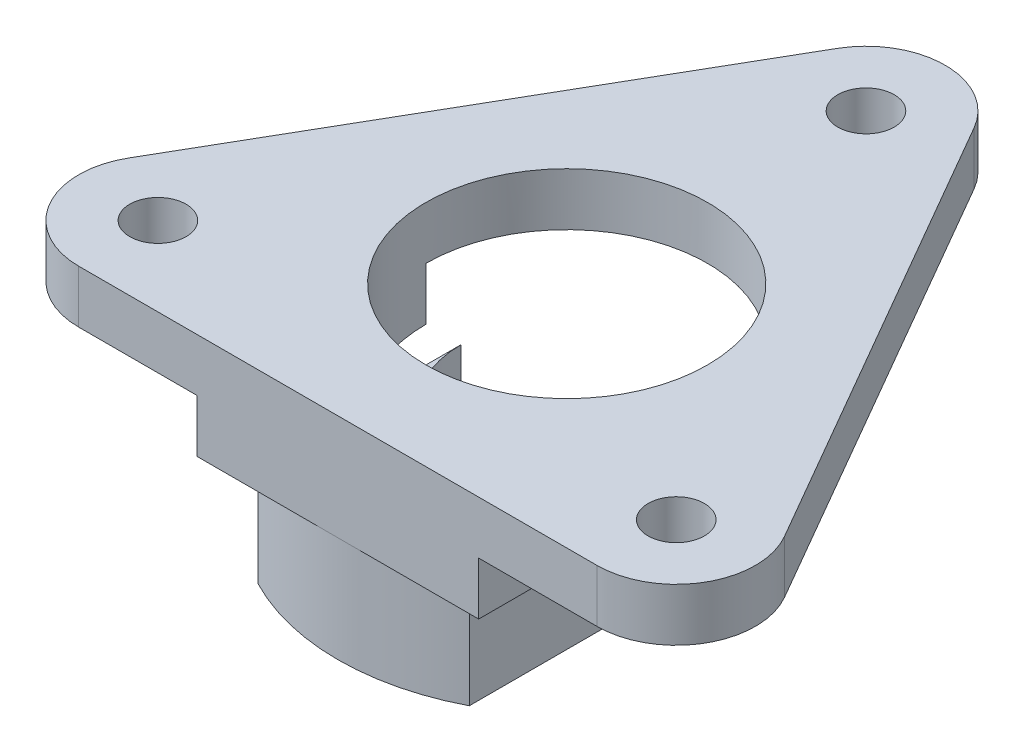
ISO-10303-21;
HEADER;
FILE_DESCRIPTION(('STEP AP214'),'2;1');
FILE_NAME('part.step','',(''),(''),'','','');
FILE_SCHEMA(('AUTOMOTIVE_DESIGN { 1 0 10303 214 1 1 1 1 }'));
ENDSEC;
DATA;
#1=APPLICATION_CONTEXT('core data for automotive mechanical design processes');
#2=APPLICATION_PROTOCOL_DEFINITION('international standard','automotive_design',2000,#1);
#3=PRODUCT_CONTEXT('',#1,'mechanical');
#4=PRODUCT('Part','Part','',(#3));
#5=PRODUCT_RELATED_PRODUCT_CATEGORY('part','',(#4));
#6=PRODUCT_DEFINITION_FORMATION('','',#4);
#7=PRODUCT_DEFINITION_CONTEXT('part definition',#1,'design');
#8=PRODUCT_DEFINITION('design','',#6,#7);
#9=PRODUCT_DEFINITION_SHAPE('','',#8);
#10=(LENGTH_UNIT() NAMED_UNIT(*) SI_UNIT(.MILLI.,.METRE.));
#11=(NAMED_UNIT(*) PLANE_ANGLE_UNIT() SI_UNIT($,.RADIAN.));
#12=(NAMED_UNIT(*) SI_UNIT($,.STERADIAN.) SOLID_ANGLE_UNIT());
#13=UNCERTAINTY_MEASURE_WITH_UNIT(LENGTH_MEASURE(1.E-05),#10,'distance_accuracy_value','');
#14=(GEOMETRIC_REPRESENTATION_CONTEXT(3) GLOBAL_UNCERTAINTY_ASSIGNED_CONTEXT((#13)) GLOBAL_UNIT_ASSIGNED_CONTEXT((#10,
#11,#12)) REPRESENTATION_CONTEXT('',''));
#15=CARTESIAN_POINT('',(0.,0.,0.));
#16=DIRECTION('',(0.,0.,1.));
#17=DIRECTION('',(1.,0.,0.));
#18=AXIS2_PLACEMENT_3D('',#15,#16,#17);
#19=CARTESIAN_POINT('',(0.,-19.160108376351,0.));
#20=DIRECTION('',(0.,1.,0.));
#21=DIRECTION('',(0.,0.,1.));
#22=AXIS2_PLACEMENT_3D('',#19,#20,#21);
#23=CYLINDRICAL_SURFACE('',#22,6.);
#24=CARTESIAN_POINT('',(0.,-13.160108376351,0.));
#25=DIRECTION('',(0.,-1.,0.));
#26=DIRECTION('',(0.,0.,1.));
#27=AXIS2_PLACEMENT_3D('',#24,#25,#26);
#28=CIRCLE('',#27,6.);
#29=CARTESIAN_POINT('',(6.,-13.160108376351,0.));
#30=VERTEX_POINT('',#29);
#31=CARTESIAN_POINT('',(-6.,-13.160108376351,0.));
#32=VERTEX_POINT('',#31);
#33=EDGE_CURVE('E205',#30,#32,#28,.T.);
#34=ORIENTED_EDGE('',*,*,#33,.F.);
#35=DIRECTION('',(0.,1.,0.));
#36=VECTOR('',#35,1.);
#37=CARTESIAN_POINT('',(6.,-19.160108376351,0.));
#38=LINE('',#37,#36);
#39=CARTESIAN_POINT('',(6.,-19.160108376351,0.));
#40=VERTEX_POINT('',#39);
#41=EDGE_CURVE('E43',#40,#30,#38,.T.);
#42=ORIENTED_EDGE('',*,*,#41,.F.);
#43=CARTESIAN_POINT('',(0.,-19.160108376351,0.));
#44=DIRECTION('',(0.,-1.,0.));
#45=DIRECTION('',(0.,0.,1.));
#46=AXIS2_PLACEMENT_3D('',#43,#44,#45);
#47=CIRCLE('',#46,6.);
#48=CARTESIAN_POINT('',(-6.,-19.160108376351,0.));
#49=VERTEX_POINT('',#48);
#50=EDGE_CURVE('E206',#40,#49,#47,.T.);
#51=ORIENTED_EDGE('',*,*,#50,.T.);
#52=DIRECTION('',(0.,1.,0.));
#53=VECTOR('',#52,1.);
#54=CARTESIAN_POINT('',(-6.,-19.160108376351,0.));
#55=LINE('',#54,#53);
#56=EDGE_CURVE('E38',#49,#32,#55,.T.);
#57=ORIENTED_EDGE('',*,*,#56,.T.);
#58=EDGE_LOOP('',(#34,#42,#51,#57));
#59=FACE_BOUND('',#58,.T.);
#60=ADVANCED_FACE('F35',(#59),#23,.F.);
#61=CARTESIAN_POINT('',(6.,-19.160108376351,0.));
#62=DIRECTION('',(1.,0.,0.));
#63=DIRECTION('',(0.,0.,-1.));
#64=AXIS2_PLACEMENT_3D('',#61,#62,#63);
#65=PLANE('',#64);
#66=DIRECTION('',(0.,0.,-1.));
#67=VECTOR('',#66,1.);
#68=CARTESIAN_POINT('',(6.,-13.160108376351,0.));
#69=LINE('',#68,#67);
#70=CARTESIAN_POINT('',(6.,-13.160108376351,11.5325625946708));
#71=VERTEX_POINT('',#70);
#72=CARTESIAN_POINT('',(6.,-13.160108376351,5.29150262212918));
#73=VERTEX_POINT('',#72);
#74=EDGE_CURVE('E210',#71,#73,#69,.T.);
#75=ORIENTED_EDGE('',*,*,#74,.F.);
#76=DIRECTION('',(0.,1.,0.));
#77=VECTOR('',#76,1.);
#78=CARTESIAN_POINT('',(6.,-19.160108376351,11.5325625946708));
#79=LINE('',#78,#77);
#80=CARTESIAN_POINT('',(6.,-19.160108376351,11.5325625946708));
#81=VERTEX_POINT('',#80);
#82=EDGE_CURVE('E231',#81,#71,#79,.T.);
#83=ORIENTED_EDGE('',*,*,#82,.F.);
#84=DIRECTION('',(0.,0.,-1.));
#85=VECTOR('',#84,1.);
#86=CARTESIAN_POINT('',(6.,-19.160108376351,0.));
#87=LINE('',#86,#85);
#88=EDGE_CURVE('E216',#81,#40,#87,.T.);
#89=ORIENTED_EDGE('',*,*,#88,.T.);
#90=ORIENTED_EDGE('',*,*,#41,.T.);
#91=EDGE_CURVE('E226',#73,#30,#69,.T.);
#92=ORIENTED_EDGE('',*,*,#91,.F.);
#93=EDGE_LOOP('',(#75,#83,#89,#90,#92));
#94=FACE_BOUND('',#93,.T.);
#95=ADVANCED_FACE('F246',(#94),#65,.T.);
#96=CARTESIAN_POINT('',(0.,-19.160108376351,0.));
#97=DIRECTION('',(0.,1.,0.));
#98=DIRECTION('',(0.,0.,1.));
#99=AXIS2_PLACEMENT_3D('',#96,#97,#98);
#100=CYLINDRICAL_SURFACE('',#99,13.);
#101=CARTESIAN_POINT('',(0.,-13.160108376351,0.));
#102=DIRECTION('',(0.,1.,0.));
#103=DIRECTION('',(0.,0.,1.));
#104=AXIS2_PLACEMENT_3D('',#101,#102,#103);
#105=CIRCLE('',#104,13.);
#106=CARTESIAN_POINT('',(-6.,-13.160108376351,11.5325625946708));
#107=VERTEX_POINT('',#106);
#108=CARTESIAN_POINT('',(0.,-13.160108376351,13.));
#109=VERTEX_POINT('',#108);
#110=EDGE_CURVE('E224',#107,#109,#105,.T.);
#111=ORIENTED_EDGE('',*,*,#110,.F.);
#112=DIRECTION('',(0.,1.,0.));
#113=VECTOR('',#112,1.);
#114=CARTESIAN_POINT('',(-6.,-19.160108376351,11.5325625946708));
#115=LINE('',#114,#113);
#116=CARTESIAN_POINT('',(-6.,-19.160108376351,11.5325625946708));
#117=VERTEX_POINT('',#116);
#118=EDGE_CURVE('E232',#117,#107,#115,.T.);
#119=ORIENTED_EDGE('',*,*,#118,.F.);
#120=CARTESIAN_POINT('',(0.,-19.160108376351,0.));
#121=DIRECTION('',(0.,1.,0.));
#122=DIRECTION('',(0.,0.,1.));
#123=AXIS2_PLACEMENT_3D('',#120,#121,#122);
#124=CIRCLE('',#123,13.);
#125=EDGE_CURVE('E213',#117,#81,#124,.T.);
#126=ORIENTED_EDGE('',*,*,#125,.T.);
#127=ORIENTED_EDGE('',*,*,#82,.T.);
#128=EDGE_CURVE('E59',#109,#71,#105,.T.);
#129=ORIENTED_EDGE('',*,*,#128,.F.);
#130=EDGE_LOOP('',(#111,#119,#126,#127,#129));
#131=FACE_BOUND('',#130,.T.);
#132=ADVANCED_FACE('F251',(#131),#100,.T.);
#133=CARTESIAN_POINT('',(-6.,-19.160108376351,0.));
#134=DIRECTION('',(-1.,0.,0.));
#135=DIRECTION('',(0.,0.,1.));
#136=AXIS2_PLACEMENT_3D('',#133,#134,#135);
#137=PLANE('',#136);
#138=DIRECTION('',(0.,0.,1.));
#139=VECTOR('',#138,1.);
#140=CARTESIAN_POINT('',(-6.,-13.160108376351,0.));
#141=LINE('',#140,#139);
#142=CARTESIAN_POINT('',(-6.,-13.160108376351,5.29150262212918));
#143=VERTEX_POINT('',#142);
#144=EDGE_CURVE('E222',#32,#143,#141,.T.);
#145=ORIENTED_EDGE('',*,*,#144,.F.);
#146=ORIENTED_EDGE('',*,*,#56,.F.);
#147=DIRECTION('',(0.,0.,1.));
#148=VECTOR('',#147,1.);
#149=CARTESIAN_POINT('',(-6.,-19.160108376351,0.));
#150=LINE('',#149,#148);
#151=EDGE_CURVE('E209',#49,#117,#150,.T.);
#152=ORIENTED_EDGE('',*,*,#151,.T.);
#153=ORIENTED_EDGE('',*,*,#118,.T.);
#154=EDGE_CURVE('E221',#143,#107,#141,.T.);
#155=ORIENTED_EDGE('',*,*,#154,.F.);
#156=EDGE_LOOP('',(#145,#146,#152,#153,#155));
#157=FACE_BOUND('',#156,.T.);
#158=ADVANCED_FACE('F240',(#157),#137,.T.);
#159=CARTESIAN_POINT('',(0.,-19.160108376351,0.));
#160=DIRECTION('',(0.,1.,0.));
#161=DIRECTION('',(0.,0.,1.));
#162=AXIS2_PLACEMENT_3D('',#159,#160,#161);
#163=PLANE('',#162);
#164=ORIENTED_EDGE('',*,*,#50,.F.);
#165=ORIENTED_EDGE('',*,*,#88,.F.);
#166=ORIENTED_EDGE('',*,*,#125,.F.);
#167=ORIENTED_EDGE('',*,*,#151,.F.);
#168=EDGE_LOOP('',(#164,#165,#166,#167));
#169=FACE_BOUND('',#168,.T.);
#170=ADVANCED_FACE('F249',(#169),#163,.F.);
#171=CARTESIAN_POINT('',(0.,-13.160108376351,0.));
#172=DIRECTION('',(0.,1.,0.));
#173=DIRECTION('',(0.,0.,1.));
#174=AXIS2_PLACEMENT_3D('',#171,#172,#173);
#175=PLANE('',#174);
#176=CARTESIAN_POINT('',(0.,-13.160108376351,0.));
#177=DIRECTION('',(0.,-1.,0.));
#178=DIRECTION('',(0.,0.,1.));
#179=AXIS2_PLACEMENT_3D('',#176,#177,#178);
#180=CIRCLE('',#179,8.);
#181=EDGE_CURVE('E11',#73,#143,#180,.T.);
#182=ORIENTED_EDGE('',*,*,#181,.F.);
#183=ORIENTED_EDGE('',*,*,#91,.T.);
#184=ORIENTED_EDGE('',*,*,#33,.T.);
#185=ORIENTED_EDGE('',*,*,#144,.T.);
#186=EDGE_LOOP('',(#182,#183,#184,#185));
#187=FACE_BOUND('',#186,.T.);
#188=ADVANCED_FACE('F243',(#187),#175,.T.);
#189=CARTESIAN_POINT('',(0.,-13.160108376351,0.));
#190=DIRECTION('',(0.,1.,0.));
#191=DIRECTION('',(0.,0.,1.));
#192=AXIS2_PLACEMENT_3D('',#189,#190,#191);
#193=PLANE('',#192);
#194=CARTESIAN_POINT('',(-8.,-13.160108376351,0.));
#195=VERTEX_POINT('',#194);
#196=EDGE_CURVE('E46',#143,#195,#180,.T.);
#197=ORIENTED_EDGE('',*,*,#196,.F.);
#198=ORIENTED_EDGE('',*,*,#154,.T.);
#199=ORIENTED_EDGE('',*,*,#110,.T.);
#200=DIRECTION('',(1.,0.,0.));
#201=VECTOR('',#200,1.);
#202=CARTESIAN_POINT('',(-8.,-13.160108376351,13.));
#203=LINE('',#202,#201);
#204=CARTESIAN_POINT('',(-8.,-13.160108376351,13.));
#205=VERTEX_POINT('',#204);
#206=EDGE_CURVE('E190',#205,#109,#203,.T.);
#207=ORIENTED_EDGE('',*,*,#206,.F.);
#208=DIRECTION('',(0.,0.,1.));
#209=VECTOR('',#208,1.);
#210=CARTESIAN_POINT('',(-8.,-13.160108376351,0.));
#211=LINE('',#210,#209);
#212=EDGE_CURVE('E187',#195,#205,#211,.T.);
#213=ORIENTED_EDGE('',*,*,#212,.F.);
#214=EDGE_LOOP('',(#197,#198,#199,#207,#213));
#215=FACE_BOUND('',#214,.T.);
#216=ADVANCED_FACE('F255',(#215),#193,.F.);
#217=CARTESIAN_POINT('',(8.,-13.160108376351,13.));
#218=VERTEX_POINT('',#217);
#219=EDGE_CURVE('E189',#109,#218,#203,.T.);
#220=ORIENTED_EDGE('',*,*,#219,.F.);
#221=ORIENTED_EDGE('',*,*,#128,.T.);
#222=ORIENTED_EDGE('',*,*,#74,.T.);
#223=CARTESIAN_POINT('',(8.,-13.160108376351,0.));
#224=VERTEX_POINT('',#223);
#225=EDGE_CURVE('E45',#224,#73,#180,.T.);
#226=ORIENTED_EDGE('',*,*,#225,.F.);
#227=DIRECTION('',(0.,0.,-1.));
#228=VECTOR('',#227,1.);
#229=CARTESIAN_POINT('',(8.,-13.160108376351,13.));
#230=LINE('',#229,#228);
#231=EDGE_CURVE('E182',#218,#224,#230,.T.);
#232=ORIENTED_EDGE('',*,*,#231,.F.);
#233=EDGE_LOOP('',(#220,#221,#222,#226,#232));
#234=FACE_BOUND('',#233,.T.);
#235=ADVANCED_FACE('F265',(#234),#193,.F.);
#236=CARTESIAN_POINT('',(0.,-10.160108376351,0.));
#237=DIRECTION('',(0.,-1.,0.));
#238=DIRECTION('',(0.,0.,-1.));
#239=AXIS2_PLACEMENT_3D('',#236,#237,#238);
#240=CYLINDRICAL_SURFACE('',#239,8.);
#241=ORIENTED_EDGE('',*,*,#225,.T.);
#242=ORIENTED_EDGE('',*,*,#181,.T.);
#243=ORIENTED_EDGE('',*,*,#196,.T.);
#244=DIRECTION('',(0.,-1.,0.));
#245=VECTOR('',#244,1.);
#246=CARTESIAN_POINT('',(-8.,-10.160108376351,0.));
#247=LINE('',#246,#245);
#248=CARTESIAN_POINT('',(-8.,-10.160108376351,0.));
#249=VERTEX_POINT('',#248);
#250=EDGE_CURVE('E202',#249,#195,#247,.T.);
#251=ORIENTED_EDGE('',*,*,#250,.F.);
#252=CARTESIAN_POINT('',(0.,-10.160108376351,0.));
#253=DIRECTION('',(0.,1.,0.));
#254=DIRECTION('',(0.,0.,1.));
#255=AXIS2_PLACEMENT_3D('',#252,#253,#254);
#256=CIRCLE('',#255,8.);
#257=CARTESIAN_POINT('',(8.,-10.160108376351,0.));
#258=VERTEX_POINT('',#257);
#259=EDGE_CURVE('E278',#258,#249,#256,.T.);
#260=ORIENTED_EDGE('',*,*,#259,.F.);
#261=DIRECTION('',(0.,-1.,0.));
#262=VECTOR('',#261,1.);
#263=CARTESIAN_POINT('',(8.,-10.160108376351,0.));
#264=LINE('',#263,#262);
#265=EDGE_CURVE('E184',#258,#224,#264,.T.);
#266=ORIENTED_EDGE('',*,*,#265,.T.);
#267=EDGE_LOOP('',(#241,#242,#243,#251,#260,#266));
#268=FACE_BOUND('',#267,.T.);
#269=CARTESIAN_POINT('',(0.,-7.16010837635103,0.));
#270=DIRECTION('',(0.,1.,0.));
#271=DIRECTION('',(0.,0.,1.));
#272=AXIS2_PLACEMENT_3D('',#269,#270,#271);
#273=CIRCLE('',#272,8.);
#274=CARTESIAN_POINT('',(0.,-7.16010837635103,8.));
#275=VERTEX_POINT('',#274);
#276=EDGE_CURVE('E281',#275,#275,#273,.T.);
#277=ORIENTED_EDGE('',*,*,#276,.T.);
#278=EDGE_LOOP('',(#277));
#279=FACE_BOUND('',#278,.T.);
#280=ADVANCED_FACE('F259',(#268,#279),#240,.F.);
#281=CARTESIAN_POINT('',(-8.,-10.160108376351,0.));
#282=DIRECTION('',(1.,0.,0.));
#283=DIRECTION('',(0.,0.,-1.));
#284=AXIS2_PLACEMENT_3D('',#281,#282,#283);
#285=PLANE('',#284);
#286=ORIENTED_EDGE('',*,*,#212,.T.);
#287=DIRECTION('',(0.,-1.,0.));
#288=VECTOR('',#287,1.);
#289=CARTESIAN_POINT('',(-8.,-10.160108376351,13.));
#290=LINE('',#289,#288);
#291=CARTESIAN_POINT('',(-8.,-10.160108376351,13.));
#292=VERTEX_POINT('',#291);
#293=EDGE_CURVE('E199',#292,#205,#290,.T.);
#294=ORIENTED_EDGE('',*,*,#293,.F.);
#295=DIRECTION('',(0.,0.,1.));
#296=VECTOR('',#295,1.);
#297=CARTESIAN_POINT('',(-8.,-10.160108376351,0.));
#298=LINE('',#297,#296);
#299=EDGE_CURVE('E178',#249,#292,#298,.T.);
#300=ORIENTED_EDGE('',*,*,#299,.F.);
#301=ORIENTED_EDGE('',*,*,#250,.T.);
#302=EDGE_LOOP('',(#286,#294,#300,#301));
#303=FACE_BOUND('',#302,.T.);
#304=ADVANCED_FACE('F273',(#303),#285,.F.);
#305=CARTESIAN_POINT('',(-8.,-10.160108376351,13.));
#306=DIRECTION('',(0.,0.,-1.));
#307=DIRECTION('',(-1.,0.,0.));
#308=AXIS2_PLACEMENT_3D('',#305,#306,#307);
#309=PLANE('',#308);
#310=ORIENTED_EDGE('',*,*,#206,.T.);
#311=ORIENTED_EDGE('',*,*,#219,.T.);
#312=DIRECTION('',(0.,-1.,0.));
#313=VECTOR('',#312,1.);
#314=CARTESIAN_POINT('',(8.,-10.160108376351,13.));
#315=LINE('',#314,#313);
#316=CARTESIAN_POINT('',(8.,-10.160108376351,13.));
#317=VERTEX_POINT('',#316);
#318=EDGE_CURVE('E196',#317,#218,#315,.T.);
#319=ORIENTED_EDGE('',*,*,#318,.F.);
#320=DIRECTION('',(1.,0.,0.));
#321=VECTOR('',#320,1.);
#322=CARTESIAN_POINT('',(-14.7224318643354,-10.160108376351,13.));
#323=LINE('',#322,#321);
#324=CARTESIAN_POINT('',(14.7224318643354,-10.160108376351,13.));
#325=VERTEX_POINT('',#324);
#326=EDGE_CURVE('E302',#317,#325,#323,.T.);
#327=ORIENTED_EDGE('',*,*,#326,.T.);
#328=DIRECTION('',(0.,-1.,0.));
#329=VECTOR('',#328,1.);
#330=CARTESIAN_POINT('',(14.7224318643354,-7.16010837635103,13.));
#331=LINE('',#330,#329);
#332=CARTESIAN_POINT('',(14.7224318643354,-7.16010837635103,13.));
#333=VERTEX_POINT('',#332);
#334=EDGE_CURVE('E311',#333,#325,#331,.T.);
#335=ORIENTED_EDGE('',*,*,#334,.F.);
#336=DIRECTION('',(1.,0.,0.));
#337=VECTOR('',#336,1.);
#338=CARTESIAN_POINT('',(-14.7224318643354,-7.16010837635103,13.));
#339=LINE('',#338,#337);
#340=CARTESIAN_POINT('',(-14.7224318643354,-7.16010837635103,13.));
#341=VERTEX_POINT('',#340);
#342=EDGE_CURVE('E291',#341,#333,#339,.T.);
#343=ORIENTED_EDGE('',*,*,#342,.F.);
#344=DIRECTION('',(0.,-1.,0.));
#345=VECTOR('',#344,1.);
#346=CARTESIAN_POINT('',(-14.7224318643354,-7.16010837635103,13.));
#347=LINE('',#346,#345);
#348=CARTESIAN_POINT('',(-14.7224318643354,-10.160108376351,13.));
#349=VERTEX_POINT('',#348);
#350=EDGE_CURVE('E174',#341,#349,#347,.T.);
#351=ORIENTED_EDGE('',*,*,#350,.T.);
#352=EDGE_CURVE('E271',#349,#292,#323,.T.);
#353=ORIENTED_EDGE('',*,*,#352,.T.);
#354=ORIENTED_EDGE('',*,*,#293,.T.);
#355=EDGE_LOOP('',(#310,#311,#319,#327,#335,#343,#351,#353,#354));
#356=FACE_BOUND('',#355,.T.);
#357=ADVANCED_FACE('F267',(#356),#309,.F.);
#358=CARTESIAN_POINT('',(8.,-10.160108376351,13.));
#359=DIRECTION('',(-1.,0.,0.));
#360=DIRECTION('',(0.,0.,1.));
#361=AXIS2_PLACEMENT_3D('',#358,#359,#360);
#362=PLANE('',#361);
#363=ORIENTED_EDGE('',*,*,#231,.T.);
#364=ORIENTED_EDGE('',*,*,#265,.F.);
#365=DIRECTION('',(0.,0.,-1.));
#366=VECTOR('',#365,1.);
#367=CARTESIAN_POINT('',(8.,-10.160108376351,13.));
#368=LINE('',#367,#366);
#369=EDGE_CURVE('E181',#317,#258,#368,.T.);
#370=ORIENTED_EDGE('',*,*,#369,.F.);
#371=ORIENTED_EDGE('',*,*,#318,.T.);
#372=EDGE_LOOP('',(#363,#364,#370,#371));
#373=FACE_BOUND('',#372,.T.);
#374=ADVANCED_FACE('F327',(#373),#362,.F.);
#375=CARTESIAN_POINT('',(0.,-10.160108376351,-17.));
#376=DIRECTION('',(0.,1.,0.));
#377=DIRECTION('',(0.,0.,1.));
#378=AXIS2_PLACEMENT_3D('',#375,#376,#377);
#379=PLANE('',#378);
#380=CARTESIAN_POINT('',(0.,-10.160108376351,-17.));
#381=DIRECTION('',(0.,1.,0.));
#382=DIRECTION('',(0.,0.,1.));
#383=AXIS2_PLACEMENT_3D('',#380,#381,#382);
#384=CIRCLE('',#383,1.6);
#385=CARTESIAN_POINT('',(0.,-10.160108376351,-15.4));
#386=VERTEX_POINT('',#385);
#387=EDGE_CURVE('E518',#386,#386,#384,.T.);
#388=ORIENTED_EDGE('',*,*,#387,.T.);
#389=EDGE_LOOP('',(#388));
#390=FACE_BOUND('',#389,.T.);
#391=CARTESIAN_POINT('',(14.7224318643354,-10.160108376351,8.49999999999998));
#392=DIRECTION('',(0.,1.,0.));
#393=DIRECTION('',(0.,0.,1.));
#394=AXIS2_PLACEMENT_3D('',#391,#392,#393);
#395=CIRCLE('',#394,1.6);
#396=CARTESIAN_POINT('',(14.7224318643354,-10.160108376351,10.1));
#397=VERTEX_POINT('',#396);
#398=EDGE_CURVE('E522',#397,#397,#395,.T.);
#399=ORIENTED_EDGE('',*,*,#398,.T.);
#400=EDGE_LOOP('',(#399));
#401=FACE_BOUND('',#400,.T.);
#402=CARTESIAN_POINT('',(-14.7224318643354,-10.160108376351,8.49999999999998));
#403=DIRECTION('',(0.,1.,0.));
#404=DIRECTION('',(0.,0.,1.));
#405=AXIS2_PLACEMENT_3D('',#402,#403,#404);
#406=CIRCLE('',#405,1.6);
#407=CARTESIAN_POINT('',(-14.7224318643354,-10.160108376351,10.1));
#408=VERTEX_POINT('',#407);
#409=EDGE_CURVE('E287',#408,#408,#406,.T.);
#410=ORIENTED_EDGE('',*,*,#409,.T.);
#411=EDGE_LOOP('',(#410));
#412=FACE_BOUND('',#411,.T.);
#413=ORIENTED_EDGE('',*,*,#259,.T.);
#414=ORIENTED_EDGE('',*,*,#299,.T.);
#415=ORIENTED_EDGE('',*,*,#352,.F.);
#416=CARTESIAN_POINT('',(-14.7224318643354,-10.160108376351,8.49999999999998));
#417=DIRECTION('',(0.,1.,0.));
#418=DIRECTION('',(0.,0.,1.));
#419=AXIS2_PLACEMENT_3D('',#416,#417,#418);
#420=CIRCLE('',#419,4.50000000000002);
#421=CARTESIAN_POINT('',(-18.6195461813654,-10.160108376351,6.24999999999996));
#422=VERTEX_POINT('',#421);
#423=EDGE_CURVE('E300',#422,#349,#420,.T.);
#424=ORIENTED_EDGE('',*,*,#423,.F.);
#425=DIRECTION('',(-0.5,0.,0.866025403784438));
#426=VECTOR('',#425,1.);
#427=CARTESIAN_POINT('',(-3.89711431702998,-10.160108376351,-19.25));
#428=LINE('',#427,#426);
#429=CARTESIAN_POINT('',(-3.89711431702998,-10.160108376351,-19.25));
#430=VERTEX_POINT('',#429);
#431=EDGE_CURVE('E298',#430,#422,#428,.T.);
#432=ORIENTED_EDGE('',*,*,#431,.F.);
#433=CARTESIAN_POINT('',(0.,-10.160108376351,-17.));
#434=DIRECTION('',(0.,1.,0.));
#435=DIRECTION('',(0.,0.,1.));
#436=AXIS2_PLACEMENT_3D('',#433,#434,#435);
#437=CIRCLE('',#436,4.50000000000001);
#438=CARTESIAN_POINT('',(3.89711431702998,-10.160108376351,-19.25));
#439=VERTEX_POINT('',#438);
#440=EDGE_CURVE('E172',#439,#430,#437,.T.);
#441=ORIENTED_EDGE('',*,*,#440,.F.);
#442=DIRECTION('',(-0.5,0.,-0.866025403784438));
#443=VECTOR('',#442,1.);
#444=CARTESIAN_POINT('',(18.6195461813654,-10.160108376351,6.24999999999996));
#445=LINE('',#444,#443);
#446=CARTESIAN_POINT('',(18.6195461813654,-10.160108376351,6.24999999999996));
#447=VERTEX_POINT('',#446);
#448=EDGE_CURVE('E168',#447,#439,#445,.T.);
#449=ORIENTED_EDGE('',*,*,#448,.F.);
#450=CARTESIAN_POINT('',(14.7224318643354,-10.160108376351,8.49999999999998));
#451=DIRECTION('',(0.,1.,0.));
#452=DIRECTION('',(0.,0.,1.));
#453=AXIS2_PLACEMENT_3D('',#450,#451,#452);
#454=CIRCLE('',#453,4.50000000000002);
#455=EDGE_CURVE('E304',#325,#447,#454,.T.);
#456=ORIENTED_EDGE('',*,*,#455,.F.);
#457=ORIENTED_EDGE('',*,*,#326,.F.);
#458=ORIENTED_EDGE('',*,*,#369,.T.);
#459=EDGE_LOOP('',(#413,#414,#415,#424,#432,#441,#449,#456,#457,#458));
#460=FACE_BOUND('',#459,.T.);
#461=ADVANCED_FACE('F276',(#390,#401,#412,#460),#379,.F.);
#462=CARTESIAN_POINT('',(0.,-7.16010837635103,-17.));
#463=DIRECTION('',(0.,1.,0.));
#464=DIRECTION('',(0.,0.,1.));
#465=AXIS2_PLACEMENT_3D('',#462,#463,#464);
#466=PLANE('',#465);
#467=CARTESIAN_POINT('',(0.,-7.16010837635103,-17.));
#468=DIRECTION('',(0.,1.,0.));
#469=DIRECTION('',(0.,0.,1.));
#470=AXIS2_PLACEMENT_3D('',#467,#468,#469);
#471=CIRCLE('',#470,1.6);
#472=CARTESIAN_POINT('',(0.,-7.16010837635103,-15.4));
#473=VERTEX_POINT('',#472);
#474=EDGE_CURVE('E521',#473,#473,#471,.T.);
#475=ORIENTED_EDGE('',*,*,#474,.F.);
#476=EDGE_LOOP('',(#475));
#477=FACE_BOUND('',#476,.T.);
#478=CARTESIAN_POINT('',(14.7224318643354,-7.16010837635103,8.49999999999998));
#479=DIRECTION('',(0.,1.,0.));
#480=DIRECTION('',(0.,0.,1.));
#481=AXIS2_PLACEMENT_3D('',#478,#479,#480);
#482=CIRCLE('',#481,1.6);
#483=CARTESIAN_POINT('',(14.7224318643354,-7.16010837635103,10.1));
#484=VERTEX_POINT('',#483);
#485=EDGE_CURVE('E525',#484,#484,#482,.T.);
#486=ORIENTED_EDGE('',*,*,#485,.F.);
#487=EDGE_LOOP('',(#486));
#488=FACE_BOUND('',#487,.T.);
#489=CARTESIAN_POINT('',(-14.7224318643354,-7.16010837635103,8.49999999999998));
#490=DIRECTION('',(0.,1.,0.));
#491=DIRECTION('',(0.,0.,1.));
#492=AXIS2_PLACEMENT_3D('',#489,#490,#491);
#493=CIRCLE('',#492,1.6);
#494=CARTESIAN_POINT('',(-14.7224318643354,-7.16010837635103,10.1));
#495=VERTEX_POINT('',#494);
#496=EDGE_CURVE('E282',#495,#495,#493,.T.);
#497=ORIENTED_EDGE('',*,*,#496,.F.);
#498=EDGE_LOOP('',(#497));
#499=FACE_BOUND('',#498,.T.);
#500=CARTESIAN_POINT('',(0.,-7.16010837635103,-17.));
#501=DIRECTION('',(0.,1.,0.));
#502=DIRECTION('',(0.,0.,1.));
#503=AXIS2_PLACEMENT_3D('',#500,#501,#502);
#504=CIRCLE('',#503,4.50000000000001);
#505=CARTESIAN_POINT('',(3.89711431702998,-7.16010837635103,-19.25));
#506=VERTEX_POINT('',#505);
#507=CARTESIAN_POINT('',(-3.89711431702998,-7.16010837635103,-19.25));
#508=VERTEX_POINT('',#507);
#509=EDGE_CURVE('E158',#506,#508,#504,.T.);
#510=ORIENTED_EDGE('',*,*,#509,.T.);
#511=DIRECTION('',(-0.5,0.,0.866025403784438));
#512=VECTOR('',#511,1.);
#513=CARTESIAN_POINT('',(-3.89711431702998,-7.16010837635103,-19.25));
#514=LINE('',#513,#512);
#515=CARTESIAN_POINT('',(-18.6195461813654,-7.16010837635103,6.24999999999996));
#516=VERTEX_POINT('',#515);
#517=EDGE_CURVE('E147',#508,#516,#514,.T.);
#518=ORIENTED_EDGE('',*,*,#517,.T.);
#519=CARTESIAN_POINT('',(-14.7224318643354,-7.16010837635103,8.49999999999998));
#520=DIRECTION('',(0.,1.,0.));
#521=DIRECTION('',(0.,0.,1.));
#522=AXIS2_PLACEMENT_3D('',#519,#520,#521);
#523=CIRCLE('',#522,4.50000000000002);
#524=EDGE_CURVE('E157',#516,#341,#523,.T.);
#525=ORIENTED_EDGE('',*,*,#524,.T.);
#526=ORIENTED_EDGE('',*,*,#342,.T.);
#527=CARTESIAN_POINT('',(14.7224318643354,-7.16010837635103,8.49999999999998));
#528=DIRECTION('',(0.,1.,0.));
#529=DIRECTION('',(0.,0.,1.));
#530=AXIS2_PLACEMENT_3D('',#527,#528,#529);
#531=CIRCLE('',#530,4.50000000000002);
#532=CARTESIAN_POINT('',(18.6195461813654,-7.16010837635103,6.24999999999996));
#533=VERTEX_POINT('',#532);
#534=EDGE_CURVE('E293',#333,#533,#531,.T.);
#535=ORIENTED_EDGE('',*,*,#534,.T.);
#536=DIRECTION('',(-0.5,0.,-0.866025403784438));
#537=VECTOR('',#536,1.);
#538=CARTESIAN_POINT('',(18.6195461813654,-7.16010837635103,6.24999999999996));
#539=LINE('',#538,#537);
#540=EDGE_CURVE('E164',#533,#506,#539,.T.);
#541=ORIENTED_EDGE('',*,*,#540,.T.);
#542=EDGE_LOOP('',(#510,#518,#525,#526,#535,#541));
#543=FACE_BOUND('',#542,.T.);
#544=ORIENTED_EDGE('',*,*,#276,.F.);
#545=EDGE_LOOP('',(#544));
#546=FACE_BOUND('',#545,.T.);
#547=ADVANCED_FACE('F161',(#477,#488,#499,#543,#546),#466,.T.);
#548=CARTESIAN_POINT('',(0.,-7.16010837635103,-17.));
#549=DIRECTION('',(0.,-1.,0.));
#550=DIRECTION('',(0.,0.,-1.));
#551=AXIS2_PLACEMENT_3D('',#548,#549,#550);
#552=CYLINDRICAL_SURFACE('',#551,4.50000000000001);
#553=ORIENTED_EDGE('',*,*,#440,.T.);
#554=DIRECTION('',(0.,-1.,0.));
#555=VECTOR('',#554,1.);
#556=CARTESIAN_POINT('',(-3.89711431702998,-7.16010837635103,-19.25));
#557=LINE('',#556,#555);
#558=EDGE_CURVE('E151',#508,#430,#557,.T.);
#559=ORIENTED_EDGE('',*,*,#558,.F.);
#560=ORIENTED_EDGE('',*,*,#509,.F.);
#561=DIRECTION('',(0.,-1.,0.));
#562=VECTOR('',#561,1.);
#563=CARTESIAN_POINT('',(3.89711431702998,-7.16010837635103,-19.25));
#564=LINE('',#563,#562);
#565=EDGE_CURVE('E296',#506,#439,#564,.T.);
#566=ORIENTED_EDGE('',*,*,#565,.T.);
#567=EDGE_LOOP('',(#553,#559,#560,#566));
#568=FACE_BOUND('',#567,.T.);
#569=ADVANCED_FACE('F170',(#568),#552,.T.);
#570=CARTESIAN_POINT('',(-3.89711431702998,-7.16010837635103,-19.25));
#571=DIRECTION('',(0.866025403784439,0.,0.5));
#572=DIRECTION('',(0.5,0.,-0.866025403784439));
#573=AXIS2_PLACEMENT_3D('',#570,#571,#572);
#574=PLANE('',#573);
#575=ORIENTED_EDGE('',*,*,#431,.T.);
#576=DIRECTION('',(0.,-1.,0.));
#577=VECTOR('',#576,1.);
#578=CARTESIAN_POINT('',(-18.6195461813654,-7.16010837635103,6.24999999999996));
#579=LINE('',#578,#577);
#580=EDGE_CURVE('E154',#516,#422,#579,.T.);
#581=ORIENTED_EDGE('',*,*,#580,.F.);
#582=ORIENTED_EDGE('',*,*,#517,.F.);
#583=ORIENTED_EDGE('',*,*,#558,.T.);
#584=EDGE_LOOP('',(#575,#581,#582,#583));
#585=FACE_BOUND('',#584,.T.);
#586=ADVANCED_FACE('F149',(#585),#574,.F.);
#587=CARTESIAN_POINT('',(-14.7224318643354,-7.16010837635103,8.49999999999998));
#588=DIRECTION('',(0.,-1.,0.));
#589=DIRECTION('',(0.,0.,-1.));
#590=AXIS2_PLACEMENT_3D('',#587,#588,#589);
#591=CYLINDRICAL_SURFACE('',#590,4.50000000000002);
#592=ORIENTED_EDGE('',*,*,#423,.T.);
#593=ORIENTED_EDGE('',*,*,#350,.F.);
#594=ORIENTED_EDGE('',*,*,#524,.F.);
#595=ORIENTED_EDGE('',*,*,#580,.T.);
#596=EDGE_LOOP('',(#592,#593,#594,#595));
#597=FACE_BOUND('',#596,.T.);
#598=ADVANCED_FACE('F317',(#597),#591,.T.);
#599=CARTESIAN_POINT('',(14.7224318643354,-7.16010837635103,8.49999999999998));
#600=DIRECTION('',(0.,-1.,0.));
#601=DIRECTION('',(0.,0.,-1.));
#602=AXIS2_PLACEMENT_3D('',#599,#600,#601);
#603=CYLINDRICAL_SURFACE('',#602,4.50000000000002);
#604=ORIENTED_EDGE('',*,*,#455,.T.);
#605=DIRECTION('',(0.,-1.,0.));
#606=VECTOR('',#605,1.);
#607=CARTESIAN_POINT('',(18.6195461813654,-7.16010837635103,6.24999999999996));
#608=LINE('',#607,#606);
#609=EDGE_CURVE('E308',#533,#447,#608,.T.);
#610=ORIENTED_EDGE('',*,*,#609,.F.);
#611=ORIENTED_EDGE('',*,*,#534,.F.);
#612=ORIENTED_EDGE('',*,*,#334,.T.);
#613=EDGE_LOOP('',(#604,#610,#611,#612));
#614=FACE_BOUND('',#613,.T.);
#615=ADVANCED_FACE('F325',(#614),#603,.T.);
#616=CARTESIAN_POINT('',(18.6195461813654,-7.16010837635103,6.24999999999996));
#617=DIRECTION('',(-0.866025403784439,0.,0.5));
#618=DIRECTION('',(0.5,0.,0.866025403784439));
#619=AXIS2_PLACEMENT_3D('',#616,#617,#618);
#620=PLANE('',#619);
#621=ORIENTED_EDGE('',*,*,#448,.T.);
#622=ORIENTED_EDGE('',*,*,#565,.F.);
#623=ORIENTED_EDGE('',*,*,#540,.F.);
#624=ORIENTED_EDGE('',*,*,#609,.T.);
#625=EDGE_LOOP('',(#621,#622,#623,#624));
#626=FACE_BOUND('',#625,.T.);
#627=ADVANCED_FACE('F321',(#626),#620,.F.);
#628=CARTESIAN_POINT('',(-14.7224318643354,-7.16010837635103,8.49999999999998));
#629=DIRECTION('',(0.,1.,0.));
#630=DIRECTION('',(0.,0.,1.));
#631=AXIS2_PLACEMENT_3D('',#628,#629,#630);
#632=CYLINDRICAL_SURFACE('',#631,1.6);
#633=ORIENTED_EDGE('',*,*,#409,.F.);
#634=EDGE_LOOP('',(#633));
#635=FACE_BOUND('',#634,.T.);
#636=ORIENTED_EDGE('',*,*,#496,.T.);
#637=EDGE_LOOP('',(#636));
#638=FACE_BOUND('',#637,.T.);
#639=ADVANCED_FACE('F419',(#635,#638),#632,.F.);
#640=CARTESIAN_POINT('',(14.7224318643354,-7.16010837635103,8.49999999999998));
#641=DIRECTION('',(0.,1.,0.));
#642=DIRECTION('',(0.,0.,1.));
#643=AXIS2_PLACEMENT_3D('',#640,#641,#642);
#644=CYLINDRICAL_SURFACE('',#643,1.6);
#645=ORIENTED_EDGE('',*,*,#398,.F.);
#646=EDGE_LOOP('',(#645));
#647=FACE_BOUND('',#646,.T.);
#648=ORIENTED_EDGE('',*,*,#485,.T.);
#649=EDGE_LOOP('',(#648));
#650=FACE_BOUND('',#649,.T.);
#651=ADVANCED_FACE('F440',(#647,#650),#644,.F.);
#652=CARTESIAN_POINT('',(0.,-7.16010837635103,-17.));
#653=DIRECTION('',(0.,1.,0.));
#654=DIRECTION('',(0.,0.,1.));
#655=AXIS2_PLACEMENT_3D('',#652,#653,#654);
#656=CYLINDRICAL_SURFACE('',#655,1.6);
#657=ORIENTED_EDGE('',*,*,#387,.F.);
#658=EDGE_LOOP('',(#657));
#659=FACE_BOUND('',#658,.T.);
#660=ORIENTED_EDGE('',*,*,#474,.T.);
#661=EDGE_LOOP('',(#660));
#662=FACE_BOUND('',#661,.T.);
#663=ADVANCED_FACE('F450',(#659,#662),#656,.F.);
#664=CLOSED_SHELL('',(#60,#95,#132,#158,#170,#188,#216,#235,#280,#304,#357,#374,#461,#547,#569,
#586,#598,#615,#627,#639,#651,#663));
#665=MANIFOLD_SOLID_BREP('B2',#664);
#666=ADVANCED_BREP_SHAPE_REPRESENTATION('',(#18,#665),#14);
#667=SHAPE_DEFINITION_REPRESENTATION(#9,#666);
ENDSEC;
END-ISO-10303-21;
